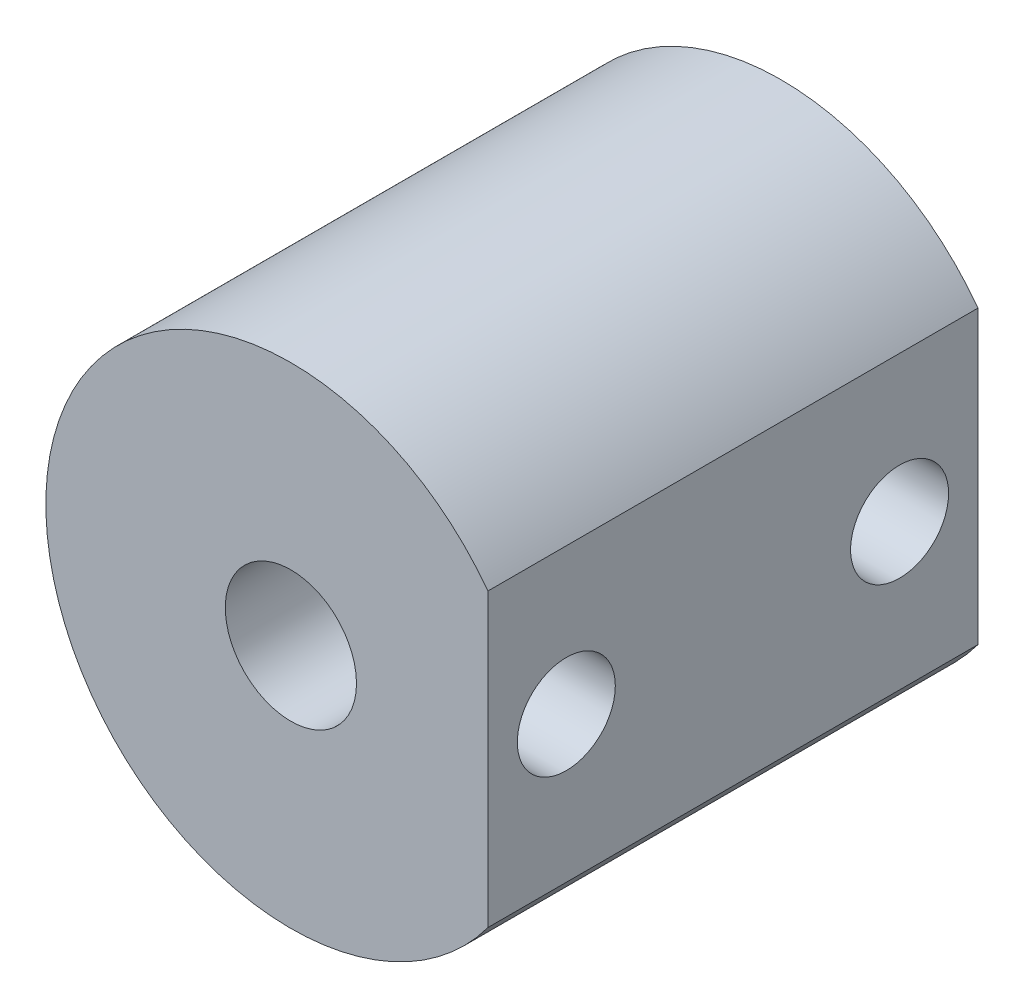
ISO-10303-21;
HEADER;
FILE_DESCRIPTION(('STEP AP214'),'2;1');
FILE_NAME('part.step','',(''),(''),'','','');
FILE_SCHEMA(('AUTOMOTIVE_DESIGN { 1 0 10303 214 1 1 1 1 }'));
ENDSEC;
DATA;
#1=APPLICATION_CONTEXT('core data for automotive mechanical design processes');
#2=APPLICATION_PROTOCOL_DEFINITION('international standard','automotive_design',2000,#1);
#3=PRODUCT_CONTEXT('',#1,'mechanical');
#4=PRODUCT('Part','Part','',(#3));
#5=PRODUCT_RELATED_PRODUCT_CATEGORY('part','',(#4));
#6=PRODUCT_DEFINITION_FORMATION('','',#4);
#7=PRODUCT_DEFINITION_CONTEXT('part definition',#1,'design');
#8=PRODUCT_DEFINITION('design','',#6,#7);
#9=PRODUCT_DEFINITION_SHAPE('','',#8);
#10=(LENGTH_UNIT() NAMED_UNIT(*) SI_UNIT(.MILLI.,.METRE.));
#11=(NAMED_UNIT(*) PLANE_ANGLE_UNIT() SI_UNIT($,.RADIAN.));
#12=(NAMED_UNIT(*) SI_UNIT($,.STERADIAN.) SOLID_ANGLE_UNIT());
#13=UNCERTAINTY_MEASURE_WITH_UNIT(LENGTH_MEASURE(1.E-05),#10,'distance_accuracy_value','');
#14=(GEOMETRIC_REPRESENTATION_CONTEXT(3) GLOBAL_UNCERTAINTY_ASSIGNED_CONTEXT((#13)) GLOBAL_UNIT_ASSIGNED_CONTEXT((#10,
#11,#12)) REPRESENTATION_CONTEXT('',''));
#15=CARTESIAN_POINT('',(0.,0.,0.));
#16=DIRECTION('',(0.,0.,1.));
#17=DIRECTION('',(1.,0.,0.));
#18=AXIS2_PLACEMENT_3D('',#15,#16,#17);
#19=CARTESIAN_POINT('',(0.,0.,6.35));
#20=DIRECTION('',(0.,0.,1.));
#21=DIRECTION('',(1.,0.,0.));
#22=AXIS2_PLACEMENT_3D('',#19,#20,#21);
#23=CYLINDRICAL_SURFACE('',#22,1.7);
#24=CARTESIAN_POINT('',(0.,0.,12.7));
#25=DIRECTION('',(0.,0.,1.));
#26=DIRECTION('',(1.,0.,0.));
#27=AXIS2_PLACEMENT_3D('',#24,#25,#26);
#28=CIRCLE('',#27,1.7);
#29=CARTESIAN_POINT('',(1.7,0.,12.7));
#30=VERTEX_POINT('',#29);
#31=EDGE_CURVE('E208',#30,#30,#28,.T.);
#32=ORIENTED_EDGE('',*,*,#31,.T.);
#33=EDGE_LOOP('',(#32));
#34=FACE_BOUND('',#33,.T.);
#35=CARTESIAN_POINT('',(0.,0.,6.35));
#36=DIRECTION('',(0.,0.,1.));
#37=DIRECTION('',(1.,0.,0.));
#38=AXIS2_PLACEMENT_3D('',#35,#36,#37);
#39=CIRCLE('',#38,1.7);
#40=CARTESIAN_POINT('',(1.7,0.,6.35));
#41=VERTEX_POINT('',#40);
#42=EDGE_CURVE('E211',#41,#41,#39,.T.);
#43=ORIENTED_EDGE('',*,*,#42,.F.);
#44=EDGE_LOOP('',(#43));
#45=FACE_BOUND('',#44,.T.);
#46=DIRECTION('',(0.,0.,1.));
#47=VECTOR('',#46,1.);
#48=CARTESIAN_POINT('',(1.2951946017097,1.10112258341297,6.35));
#49=LINE('',#48,#47);
#50=CARTESIAN_POINT('',(1.2951946017097,1.10112258341297,11.3007946399093));
#51=VERTEX_POINT('',#50);
#52=CARTESIAN_POINT('',(1.2951946017097,1.10112258341297,10.0352053600907));
#53=VERTEX_POINT('',#52);
#54=EDGE_CURVE('E11',#51,#53,#49,.F.);
#55=ORIENTED_EDGE('',*,*,#54,.F.);
#56=CARTESIAN_POINT('',(1.2951946017097,1.10112258341297,11.3007946399093));
#57=CARTESIAN_POINT('',(1.3113173687256,1.08216613180387,11.3337619197842));
#58=CARTESIAN_POINT('',(1.32787279571371,1.06184189359938,11.3657178927191));
#59=CARTESIAN_POINT('',(1.36137730272647,1.01852680407991,11.4275624808981));
#60=CARTESIAN_POINT('',(1.37832646814451,0.995535369906923,11.45745064198));
#61=CARTESIAN_POINT('',(1.41232141435796,0.946701619108911,11.5154108652147));
#62=CARTESIAN_POINT('',(1.42936626934783,0.920831262074049,11.5434598977748));
#63=CARTESIAN_POINT('',(1.46293509373535,0.866511129944811,11.5972581339285));
#64=CARTESIAN_POINT('',(1.47945908547812,0.838061465706677,11.6230074362681));
#65=CARTESIAN_POINT('',(1.52774249560604,0.748722638253251,11.696730436916));
#66=CARTESIAN_POINT('',(1.55813524484959,0.683951000967624,11.7410508948931));
#67=CARTESIAN_POINT('',(1.61184761600013,0.545361428989942,11.8176482286547));
#68=CARTESIAN_POINT('',(1.6352037706125,0.471593113324176,11.8499875170762));
#69=CARTESIAN_POINT('',(1.66668877775104,0.339598467941695,11.8931109365594));
#70=CARTESIAN_POINT('',(1.67727138425101,0.283103462620614,11.9074298176562));
#71=CARTESIAN_POINT('',(1.69268433558115,0.167893711182328,11.9282104668643));
#72=CARTESIAN_POINT('',(1.69751575531143,0.109179381975218,11.9346737032049));
#73=CARTESIAN_POINT('',(1.70100385596444,-0.00885758387635066,11.9393443321602));
#74=CARTESIAN_POINT('',(1.6996506015261,-0.0681810464494508,11.9375384408375));
#75=CARTESIAN_POINT('',(1.69086890222751,-0.185546160427944,11.9257570514304));
#76=CARTESIAN_POINT('',(1.68343948236335,-0.243587604580728,11.91578024221));
#77=CARTESIAN_POINT('',(1.66333003888365,-0.355691032554889,11.8885119373664));
#78=CARTESIAN_POINT('',(1.65075643217894,-0.409808915959445,11.8713685474691));
#79=CARTESIAN_POINT('',(1.62126304690074,-0.51425197559634,11.8305797762669));
#80=CARTESIAN_POINT('',(1.60434205153392,-0.564576084878069,11.8069325744754));
#81=CARTESIAN_POINT('',(1.56491177405399,-0.666630410538083,11.7507279904886));
#82=CARTESIAN_POINT('',(1.54197318693177,-0.717787690111496,11.7174368497656));
#83=CARTESIAN_POINT('',(1.49338732450105,-0.814069541165105,11.6446464234165));
#84=CARTESIAN_POINT('',(1.46773740934434,-0.859188134504203,11.6051410687988));
#85=CARTESIAN_POINT('',(1.41716784401171,-0.940071640037859,11.5237007181589));
#86=CARTESIAN_POINT('',(1.39233043272054,-0.976277877811575,11.4821505052677));
#87=CARTESIAN_POINT('',(1.34310354445216,-1.0429796213762,11.3946932034082));
#88=CARTESIAN_POINT('',(1.318712950277,-1.07349187716099,11.3487995117827));
#89=CARTESIAN_POINT('',(1.2951946017097,-1.10112258341297,11.3007946399093));
#90=B_SPLINE_CURVE_WITH_KNOTS('',3,(#56,#57,#58,#59,#60,#61,#62,#63,#64,#65,#66,#67,#68,#69,#70,
#71,#72,#73,#74,#75,#76,#77,#78,#79,#80,#81,#82,#83,#84,#85,#86,#87,#88,#89),.UNSPECIFIED.,.F.,
.F.,(4,2,2,2,2,2,2,2,2,2,2,2,2,2,2,2,4),(0.,0.123863180300836,0.247753479391506,
0.372978247877537,0.49819763686777,0.749183258251209,0.998842415639397,1.17578456463396,
1.35269363784413,1.52988700619039,1.70710881321811,1.88083625812305,2.05461238078352,
2.24951645474449,2.44461207353285,2.625539738844,2.80592647678083),.UNSPECIFIED.);
#91=CARTESIAN_POINT('',(1.2951946017097,-1.10112258341297,11.3007946399093));
#92=VERTEX_POINT('',#91);
#93=EDGE_CURVE('E126',#51,#92,#90,.T.);
#94=ORIENTED_EDGE('',*,*,#93,.T.);
#95=DIRECTION('',(0.,0.,1.));
#96=VECTOR('',#95,1.);
#97=CARTESIAN_POINT('',(1.2951946017097,-1.10112258341297,6.35));
#98=LINE('',#97,#96);
#99=CARTESIAN_POINT('',(1.2951946017097,-1.10112258341297,10.0352053600907));
#100=VERTEX_POINT('',#99);
#101=EDGE_CURVE('E48',#100,#92,#98,.T.);
#102=ORIENTED_EDGE('',*,*,#101,.F.);
#103=CARTESIAN_POINT('',(1.2951946017097,-1.10112258341297,10.0352053600907));
#104=CARTESIAN_POINT('',(1.3113173687256,-1.08216613180387,10.0022380802159));
#105=CARTESIAN_POINT('',(1.32787279571371,-1.06184189359938,9.97028210728091));
#106=CARTESIAN_POINT('',(1.36137730272647,-1.01852680407991,9.90843751910186));
#107=CARTESIAN_POINT('',(1.37832646814451,-0.995535369906923,9.87854935801997));
#108=CARTESIAN_POINT('',(1.41232141435796,-0.946701619108911,9.82058913478527));
#109=CARTESIAN_POINT('',(1.42936626934783,-0.920831262074049,9.79254010222524));
#110=CARTESIAN_POINT('',(1.46293509373535,-0.866511129944811,9.73874186607155));
#111=CARTESIAN_POINT('',(1.47945908547812,-0.838061465706677,9.71299256373194));
#112=CARTESIAN_POINT('',(1.52774249560604,-0.748722638253251,9.63926956308404));
#113=CARTESIAN_POINT('',(1.55813524484959,-0.683951000967624,9.59494910510688));
#114=CARTESIAN_POINT('',(1.61184761600013,-0.545361428989942,9.51835177134534));
#115=CARTESIAN_POINT('',(1.6352037706125,-0.471593113324176,9.48601248292378));
#116=CARTESIAN_POINT('',(1.66668877775104,-0.339598467941695,9.44288906344059));
#117=CARTESIAN_POINT('',(1.67727138425101,-0.283103462620614,9.42857018234377));
#118=CARTESIAN_POINT('',(1.69268433558115,-0.167893711182328,9.40778953313566));
#119=CARTESIAN_POINT('',(1.69751575531143,-0.109179381975218,9.40132629679508));
#120=CARTESIAN_POINT('',(1.70100385596444,0.00885758387635066,9.39665566783984));
#121=CARTESIAN_POINT('',(1.6996506015261,0.0681810464494508,9.39846155916254));
#122=CARTESIAN_POINT('',(1.69086890222751,0.185546160427944,9.4102429485696));
#123=CARTESIAN_POINT('',(1.68343948236335,0.243587604580728,9.42021975778995));
#124=CARTESIAN_POINT('',(1.66333003888365,0.355691032554889,9.44748806263355));
#125=CARTESIAN_POINT('',(1.65075643217894,0.409808915959445,9.46463145253094));
#126=CARTESIAN_POINT('',(1.62126304690074,0.51425197559634,9.50542022373306));
#127=CARTESIAN_POINT('',(1.60434205153392,0.564576084878069,9.52906742552461));
#128=CARTESIAN_POINT('',(1.56491177405399,0.666630410538083,9.58527200951145));
#129=CARTESIAN_POINT('',(1.54197318693177,0.717787690111496,9.61856315023443));
#130=CARTESIAN_POINT('',(1.49338732450105,0.814069541165105,9.69135357658346));
#131=CARTESIAN_POINT('',(1.46773740934434,0.859188134504203,9.73085893120118));
#132=CARTESIAN_POINT('',(1.41716784401171,0.940071640037859,9.8122992818411));
#133=CARTESIAN_POINT('',(1.39233043272054,0.976277877811575,9.8538494947323));
#134=CARTESIAN_POINT('',(1.34310354445216,1.0429796213762,9.94130679659184));
#135=CARTESIAN_POINT('',(1.318712950277,1.07349187716099,9.98720048821733));
#136=CARTESIAN_POINT('',(1.2951946017097,1.10112258341297,10.0352053600907));
#137=B_SPLINE_CURVE_WITH_KNOTS('',3,(#103,#104,#105,#106,#107,#108,#109,#110,#111,#112,#113,
#114,#115,#116,#117,#118,#119,#120,#121,#122,#123,#124,#125,#126,#127,#128,#129,#130,#131,#132,
#133,#134,#135,#136),.UNSPECIFIED.,.F.,.F.,(4,2,2,2,2,2,2,2,2,2,2,2,2,2,2,2,4),(0.,
0.123863180300834,0.247753479391506,0.372978247877537,0.49819763686777,0.749183258251209,
0.998842415639397,1.17578456463396,1.35269363784413,1.52988700619039,1.70710881321811,
1.88083625812305,2.05461238078352,2.24951645474449,2.44461207353285,2.625539738844,
2.80592647678083),.UNSPECIFIED.);
#138=EDGE_CURVE('E124',#100,#53,#137,.T.);
#139=ORIENTED_EDGE('',*,*,#138,.T.);
#140=EDGE_LOOP('',(#55,#94,#102,#139));
#141=FACE_BOUND('',#140,.T.);
#142=ADVANCED_FACE('F39',(#34,#45,#141),#23,.F.);
#143=CARTESIAN_POINT('',(0.,0.,12.7));
#144=DIRECTION('',(0.,0.,-1.));
#145=DIRECTION('',(-1.,0.,0.));
#146=AXIS2_PLACEMENT_3D('',#143,#144,#145);
#147=CYLINDRICAL_SURFACE('',#146,6.35);
#148=CARTESIAN_POINT('',(0.,0.,12.7));
#149=DIRECTION('',(0.,0.,1.));
#150=DIRECTION('',(1.,0.,0.));
#151=AXIS2_PLACEMENT_3D('',#148,#149,#150);
#152=CIRCLE('',#151,6.35);
#153=CARTESIAN_POINT('',(5.1051946017097,3.77617373523441,12.7));
#154=VERTEX_POINT('',#153);
#155=CARTESIAN_POINT('',(5.1051946017097,-3.77617373523441,12.7));
#156=VERTEX_POINT('',#155);
#157=EDGE_CURVE('E226',#154,#156,#152,.T.);
#158=ORIENTED_EDGE('',*,*,#157,.F.);
#159=DIRECTION('',(0.,0.,-1.));
#160=VECTOR('',#159,1.);
#161=CARTESIAN_POINT('',(5.1051946017097,3.77617373523441,12.7));
#162=LINE('',#161,#160);
#163=CARTESIAN_POINT('',(5.1051946017097,3.77617373523441,0.));
#164=VERTEX_POINT('',#163);
#165=EDGE_CURVE('E247',#154,#164,#162,.T.);
#166=ORIENTED_EDGE('',*,*,#165,.T.);
#167=CARTESIAN_POINT('',(0.,0.,0.));
#168=DIRECTION('',(0.,0.,1.));
#169=DIRECTION('',(1.,0.,0.));
#170=AXIS2_PLACEMENT_3D('',#167,#168,#169);
#171=CIRCLE('',#170,6.35);
#172=CARTESIAN_POINT('',(5.1051946017097,-3.77617373523441,0.));
#173=VERTEX_POINT('',#172);
#174=EDGE_CURVE('E218',#164,#173,#171,.T.);
#175=ORIENTED_EDGE('',*,*,#174,.T.);
#176=DIRECTION('',(0.,0.,-1.));
#177=VECTOR('',#176,1.);
#178=CARTESIAN_POINT('',(5.1051946017097,-3.77617373523441,14.224));
#179=LINE('',#178,#177);
#180=EDGE_CURVE('E62',#156,#173,#179,.T.);
#181=ORIENTED_EDGE('',*,*,#180,.F.);
#182=EDGE_LOOP('',(#158,#166,#175,#181));
#183=FACE_BOUND('',#182,.T.);
#184=ADVANCED_FACE('F41',(#183),#147,.T.);
#185=CARTESIAN_POINT('',(0.,0.,12.7));
#186=DIRECTION('',(0.,0.,1.));
#187=DIRECTION('',(1.,0.,0.));
#188=AXIS2_PLACEMENT_3D('',#185,#186,#187);
#189=PLANE('',#188);
#190=DIRECTION('',(0.,-1.,0.));
#191=VECTOR('',#190,1.);
#192=CARTESIAN_POINT('',(5.1051946017097,0.,12.7));
#193=LINE('',#192,#191);
#194=EDGE_CURVE('E245',#154,#156,#193,.T.);
#195=ORIENTED_EDGE('',*,*,#194,.F.);
#196=ORIENTED_EDGE('',*,*,#157,.T.);
#197=EDGE_LOOP('',(#195,#196));
#198=FACE_BOUND('',#197,.T.);
#199=ORIENTED_EDGE('',*,*,#31,.F.);
#200=EDGE_LOOP('',(#199));
#201=FACE_BOUND('',#200,.T.);
#202=ADVANCED_FACE('F203',(#198,#201),#189,.T.);
#203=CARTESIAN_POINT('',(0.,0.,0.));
#204=DIRECTION('',(0.,0.,1.));
#205=DIRECTION('',(1.,0.,0.));
#206=AXIS2_PLACEMENT_3D('',#203,#204,#205);
#207=PLANE('',#206);
#208=DIRECTION('',(-0.8672565875042,-0.497861437983069,0.));
#209=VECTOR('',#208,1.);
#210=CARTESIAN_POINT('',(2.54635924872807,-1.4785311766808,0.));
#211=LINE('',#210,#209);
#212=CARTESIAN_POINT('',(2.54635924872807,-1.4785311766808,0.));
#213=VERTEX_POINT('',#212);
#214=CARTESIAN_POINT('',(-0.00726593492883748,-2.94447738490035,0.));
#215=VERTEX_POINT('',#214);
#216=EDGE_CURVE('E268',#213,#215,#211,.T.);
#217=ORIENTED_EDGE('',*,*,#216,.F.);
#218=DIRECTION('',(-0.00246764089411244,-0.999996955369574,0.));
#219=VECTOR('',#218,1.);
#220=CARTESIAN_POINT('',(2.55362518365693,1.46594620821955,0.));
#221=LINE('',#220,#219);
#222=CARTESIAN_POINT('',(2.55362518365693,1.46594620821955,0.));
#223=VERTEX_POINT('',#222);
#224=EDGE_CURVE('E273',#223,#213,#221,.T.);
#225=ORIENTED_EDGE('',*,*,#224,.F.);
#226=DIRECTION('',(0.864788946610089,-0.502135517386504,0.));
#227=VECTOR('',#226,1.);
#228=CARTESIAN_POINT('',(0.00726593492886285,2.94447738490036,0.));
#229=LINE('',#228,#227);
#230=CARTESIAN_POINT('',(0.00726593492886285,2.94447738490036,0.));
#231=VERTEX_POINT('',#230);
#232=EDGE_CURVE('E279',#231,#223,#229,.T.);
#233=ORIENTED_EDGE('',*,*,#232,.F.);
#234=DIRECTION('',(0.867256587504202,0.497861437983067,0.));
#235=VECTOR('',#234,1.);
#236=CARTESIAN_POINT('',(-2.54635924872805,1.47853117668082,0.));
#237=LINE('',#236,#235);
#238=CARTESIAN_POINT('',(-2.54635924872805,1.47853117668082,0.));
#239=VERTEX_POINT('',#238);
#240=EDGE_CURVE('E311',#239,#231,#237,.T.);
#241=ORIENTED_EDGE('',*,*,#240,.F.);
#242=DIRECTION('',(0.00246764089410772,0.999996955369574,0.));
#243=VECTOR('',#242,1.);
#244=CARTESIAN_POINT('',(-2.55362518365689,-1.46594620821953,0.));
#245=LINE('',#244,#243);
#246=CARTESIAN_POINT('',(-2.55362518365689,-1.46594620821953,0.));
#247=VERTEX_POINT('',#246);
#248=EDGE_CURVE('E307',#247,#239,#245,.T.);
#249=ORIENTED_EDGE('',*,*,#248,.F.);
#250=DIRECTION('',(-0.864788946610088,0.502135517386506,0.));
#251=VECTOR('',#250,1.);
#252=CARTESIAN_POINT('',(-0.00726593492883748,-2.94447738490035,0.));
#253=LINE('',#252,#251);
#254=EDGE_CURVE('E303',#215,#247,#253,.T.);
#255=ORIENTED_EDGE('',*,*,#254,.F.);
#256=EDGE_LOOP('',(#217,#225,#233,#241,#249,#255));
#257=FACE_BOUND('',#256,.T.);
#258=ORIENTED_EDGE('',*,*,#174,.F.);
#259=DIRECTION('',(0.,1.,0.));
#260=VECTOR('',#259,1.);
#261=CARTESIAN_POINT('',(5.1051946017097,-3.77617373523441,0.));
#262=LINE('',#261,#260);
#263=EDGE_CURVE('E134',#173,#164,#262,.T.);
#264=ORIENTED_EDGE('',*,*,#263,.F.);
#265=EDGE_LOOP('',(#258,#264));
#266=FACE_BOUND('',#265,.T.);
#267=ADVANCED_FACE('F173',(#257,#266),#207,.F.);
#268=CARTESIAN_POINT('',(0.,0.,6.35));
#269=DIRECTION('',(0.,0.,-1.));
#270=DIRECTION('',(-1.,0.,0.));
#271=AXIS2_PLACEMENT_3D('',#268,#269,#270);
#272=PLANE('',#271);
#273=DIRECTION('',(-0.00246764089411244,-0.999996955369574,0.));
#274=VECTOR('',#273,1.);
#275=CARTESIAN_POINT('',(2.55362518365693,1.46594620821955,6.35));
#276=LINE('',#275,#274);
#277=CARTESIAN_POINT('',(2.55362518365693,1.46594620821955,6.35));
#278=VERTEX_POINT('',#277);
#279=CARTESIAN_POINT('',(2.54635924872807,-1.4785311766808,6.35));
#280=VERTEX_POINT('',#279);
#281=EDGE_CURVE('E274',#278,#280,#276,.T.);
#282=ORIENTED_EDGE('',*,*,#281,.T.);
#283=DIRECTION('',(-0.8672565875042,-0.497861437983069,0.));
#284=VECTOR('',#283,1.);
#285=CARTESIAN_POINT('',(2.54635924872807,-1.4785311766808,6.35));
#286=LINE('',#285,#284);
#287=CARTESIAN_POINT('',(-0.00726593492883748,-2.94447738490035,6.35));
#288=VERTEX_POINT('',#287);
#289=EDGE_CURVE('E278',#280,#288,#286,.T.);
#290=ORIENTED_EDGE('',*,*,#289,.T.);
#291=DIRECTION('',(-0.864788946610088,0.502135517386506,0.));
#292=VECTOR('',#291,1.);
#293=CARTESIAN_POINT('',(-0.00726593492883748,-2.94447738490035,6.35));
#294=LINE('',#293,#292);
#295=CARTESIAN_POINT('',(-2.55362518365689,-1.46594620821953,6.35));
#296=VERTEX_POINT('',#295);
#297=EDGE_CURVE('E283',#288,#296,#294,.T.);
#298=ORIENTED_EDGE('',*,*,#297,.T.);
#299=DIRECTION('',(0.00246764089410772,0.999996955369574,0.));
#300=VECTOR('',#299,1.);
#301=CARTESIAN_POINT('',(-2.55362518365689,-1.46594620821953,6.35));
#302=LINE('',#301,#300);
#303=CARTESIAN_POINT('',(-2.54635924872805,1.47853117668082,6.35));
#304=VERTEX_POINT('',#303);
#305=EDGE_CURVE('E287',#296,#304,#302,.T.);
#306=ORIENTED_EDGE('',*,*,#305,.T.);
#307=DIRECTION('',(0.867256587504202,0.497861437983067,0.));
#308=VECTOR('',#307,1.);
#309=CARTESIAN_POINT('',(-2.54635924872805,1.47853117668082,6.35));
#310=LINE('',#309,#308);
#311=CARTESIAN_POINT('',(0.00726593492886285,2.94447738490036,6.35));
#312=VERTEX_POINT('',#311);
#313=EDGE_CURVE('E291',#304,#312,#310,.T.);
#314=ORIENTED_EDGE('',*,*,#313,.T.);
#315=DIRECTION('',(0.864788946610089,-0.502135517386504,0.));
#316=VECTOR('',#315,1.);
#317=CARTESIAN_POINT('',(0.00726593492886285,2.94447738490036,6.35));
#318=LINE('',#317,#316);
#319=EDGE_CURVE('E295',#312,#278,#318,.T.);
#320=ORIENTED_EDGE('',*,*,#319,.T.);
#321=EDGE_LOOP('',(#282,#290,#298,#306,#314,#320));
#322=FACE_BOUND('',#321,.T.);
#323=ORIENTED_EDGE('',*,*,#42,.T.);
#324=EDGE_LOOP('',(#323));
#325=FACE_BOUND('',#324,.T.);
#326=ADVANCED_FACE('F169',(#322,#325),#272,.T.);
#327=CARTESIAN_POINT('',(2.55362518365693,1.46594620821955,6.35));
#328=DIRECTION('',(0.999996955369574,-0.00246764089411244,0.));
#329=DIRECTION('',(0.00246764089411244,0.999996955369574,0.));
#330=AXIS2_PLACEMENT_3D('',#327,#328,#329);
#331=PLANE('',#330);
#332=CARTESIAN_POINT('',(2.55000774383119,0.,2.032));
#333=DIRECTION('',(0.999996955369574,-0.00246764089411244,0.));
#334=DIRECTION('',(0.00246764089411244,0.999996955369574,0.));
#335=AXIS2_PLACEMENT_3D('',#332,#333,#334);
#336=ELLIPSE('',#335,1.27000386669241,1.27);
#337=CARTESIAN_POINT('',(2.55314165730832,1.27,2.032));
#338=VERTEX_POINT('',#337);
#339=EDGE_CURVE('E128',#338,#338,#336,.T.);
#340=ORIENTED_EDGE('',*,*,#339,.T.);
#341=EDGE_LOOP('',(#340));
#342=FACE_BOUND('',#341,.T.);
#343=ORIENTED_EDGE('',*,*,#224,.T.);
#344=DIRECTION('',(0.,0.,-1.));
#345=VECTOR('',#344,1.);
#346=CARTESIAN_POINT('',(2.54635924872807,-1.4785311766808,6.35));
#347=LINE('',#346,#345);
#348=EDGE_CURVE('E223',#280,#213,#347,.T.);
#349=ORIENTED_EDGE('',*,*,#348,.F.);
#350=ORIENTED_EDGE('',*,*,#281,.F.);
#351=DIRECTION('',(0.,0.,-1.));
#352=VECTOR('',#351,1.);
#353=CARTESIAN_POINT('',(2.55362518365693,1.46594620821955,6.35));
#354=LINE('',#353,#352);
#355=EDGE_CURVE('E214',#278,#223,#354,.T.);
#356=ORIENTED_EDGE('',*,*,#355,.T.);
#357=EDGE_LOOP('',(#343,#349,#350,#356));
#358=FACE_BOUND('',#357,.T.);
#359=ADVANCED_FACE('F172',(#342,#358),#331,.F.);
#360=CARTESIAN_POINT('',(0.00726593492886285,2.94447738490036,6.35));
#361=DIRECTION('',(0.502135517386504,0.864788946610089,0.));
#362=DIRECTION('',(-0.864788946610089,0.502135517386504,0.));
#363=AXIS2_PLACEMENT_3D('',#360,#361,#362);
#364=PLANE('',#363);
#365=ORIENTED_EDGE('',*,*,#232,.T.);
#366=ORIENTED_EDGE('',*,*,#355,.F.);
#367=ORIENTED_EDGE('',*,*,#319,.F.);
#368=DIRECTION('',(0.,0.,-1.));
#369=VECTOR('',#368,1.);
#370=CARTESIAN_POINT('',(0.00726593492886285,2.94447738490036,6.35));
#371=LINE('',#370,#369);
#372=EDGE_CURVE('E220',#312,#231,#371,.T.);
#373=ORIENTED_EDGE('',*,*,#372,.T.);
#374=EDGE_LOOP('',(#365,#366,#367,#373));
#375=FACE_BOUND('',#374,.T.);
#376=ADVANCED_FACE('F175',(#375),#364,.F.);
#377=CARTESIAN_POINT('',(-2.54635924872805,1.47853117668082,6.35));
#378=DIRECTION('',(-0.497861437983067,0.867256587504202,0.));
#379=DIRECTION('',(-0.867256587504202,-0.497861437983067,0.));
#380=AXIS2_PLACEMENT_3D('',#377,#378,#379);
#381=PLANE('',#380);
#382=ORIENTED_EDGE('',*,*,#240,.T.);
#383=ORIENTED_EDGE('',*,*,#372,.F.);
#384=ORIENTED_EDGE('',*,*,#313,.F.);
#385=DIRECTION('',(0.,0.,-1.));
#386=VECTOR('',#385,1.);
#387=CARTESIAN_POINT('',(-2.54635924872805,1.47853117668082,6.35));
#388=LINE('',#387,#386);
#389=EDGE_CURVE('E320',#304,#239,#388,.T.);
#390=ORIENTED_EDGE('',*,*,#389,.T.);
#391=EDGE_LOOP('',(#382,#383,#384,#390));
#392=FACE_BOUND('',#391,.T.);
#393=ADVANCED_FACE('F178',(#392),#381,.F.);
#394=CARTESIAN_POINT('',(-2.55362518365689,-1.46594620821953,6.35));
#395=DIRECTION('',(-0.999996955369574,0.00246764089410772,0.));
#396=DIRECTION('',(-0.00246764089410772,-0.999996955369574,0.));
#397=AXIS2_PLACEMENT_3D('',#394,#395,#396);
#398=PLANE('',#397);
#399=ORIENTED_EDGE('',*,*,#248,.T.);
#400=ORIENTED_EDGE('',*,*,#389,.F.);
#401=ORIENTED_EDGE('',*,*,#305,.F.);
#402=DIRECTION('',(0.,0.,-1.));
#403=VECTOR('',#402,1.);
#404=CARTESIAN_POINT('',(-2.55362518365689,-1.46594620821953,6.35));
#405=LINE('',#404,#403);
#406=EDGE_CURVE('E323',#296,#247,#405,.T.);
#407=ORIENTED_EDGE('',*,*,#406,.T.);
#408=EDGE_LOOP('',(#399,#400,#401,#407));
#409=FACE_BOUND('',#408,.T.);
#410=ADVANCED_FACE('F182',(#409),#398,.F.);
#411=CARTESIAN_POINT('',(-0.00726593492883748,-2.94447738490035,6.35));
#412=DIRECTION('',(-0.502135517386506,-0.864788946610088,0.));
#413=DIRECTION('',(0.864788946610088,-0.502135517386506,0.));
#414=AXIS2_PLACEMENT_3D('',#411,#412,#413);
#415=PLANE('',#414);
#416=ORIENTED_EDGE('',*,*,#254,.T.);
#417=ORIENTED_EDGE('',*,*,#406,.F.);
#418=ORIENTED_EDGE('',*,*,#297,.F.);
#419=DIRECTION('',(0.,0.,-1.));
#420=VECTOR('',#419,1.);
#421=CARTESIAN_POINT('',(-0.00726593492883748,-2.94447738490035,6.35));
#422=LINE('',#421,#420);
#423=EDGE_CURVE('E325',#288,#215,#422,.T.);
#424=ORIENTED_EDGE('',*,*,#423,.T.);
#425=EDGE_LOOP('',(#416,#417,#418,#424));
#426=FACE_BOUND('',#425,.T.);
#427=ADVANCED_FACE('F186',(#426),#415,.F.);
#428=CARTESIAN_POINT('',(2.54635924872807,-1.4785311766808,6.35));
#429=DIRECTION('',(0.497861437983069,-0.8672565875042,0.));
#430=DIRECTION('',(0.8672565875042,0.497861437983069,0.));
#431=AXIS2_PLACEMENT_3D('',#428,#429,#430);
#432=PLANE('',#431);
#433=ORIENTED_EDGE('',*,*,#216,.T.);
#434=ORIENTED_EDGE('',*,*,#423,.F.);
#435=ORIENTED_EDGE('',*,*,#289,.F.);
#436=ORIENTED_EDGE('',*,*,#348,.T.);
#437=EDGE_LOOP('',(#433,#434,#435,#436));
#438=FACE_BOUND('',#437,.T.);
#439=ADVANCED_FACE('F167',(#438),#432,.F.);
#440=CARTESIAN_POINT('',(5.1051946017097,-3.77617373523441,14.224));
#441=DIRECTION('',(-1.,0.,0.));
#442=DIRECTION('',(0.,0.,1.));
#443=AXIS2_PLACEMENT_3D('',#440,#441,#442);
#444=PLANE('',#443);
#445=CARTESIAN_POINT('',(5.1051946017097,0.,10.668));
#446=DIRECTION('',(1.,0.,0.));
#447=DIRECTION('',(0.,0.,-1.));
#448=AXIS2_PLACEMENT_3D('',#445,#446,#447);
#449=CIRCLE('',#448,1.27);
#450=CARTESIAN_POINT('',(5.1051946017097,0.,9.398));
#451=VERTEX_POINT('',#450);
#452=EDGE_CURVE('E234',#451,#451,#449,.T.);
#453=ORIENTED_EDGE('',*,*,#452,.F.);
#454=EDGE_LOOP('',(#453));
#455=FACE_BOUND('',#454,.T.);
#456=CARTESIAN_POINT('',(5.1051946017097,0.,2.032));
#457=DIRECTION('',(1.,0.,0.));
#458=DIRECTION('',(0.,0.,-1.));
#459=AXIS2_PLACEMENT_3D('',#456,#457,#458);
#460=CIRCLE('',#459,1.27);
#461=CARTESIAN_POINT('',(5.1051946017097,0.,0.762));
#462=VERTEX_POINT('',#461);
#463=EDGE_CURVE('E237',#462,#462,#460,.T.);
#464=ORIENTED_EDGE('',*,*,#463,.F.);
#465=EDGE_LOOP('',(#464));
#466=FACE_BOUND('',#465,.T.);
#467=ORIENTED_EDGE('',*,*,#194,.T.);
#468=ORIENTED_EDGE('',*,*,#180,.T.);
#469=ORIENTED_EDGE('',*,*,#263,.T.);
#470=ORIENTED_EDGE('',*,*,#165,.F.);
#471=EDGE_LOOP('',(#467,#468,#469,#470));
#472=FACE_BOUND('',#471,.T.);
#473=ADVANCED_FACE('F163',(#455,#466,#472),#444,.F.);
#474=CARTESIAN_POINT('',(1.2951946017097,0.,2.032));
#475=DIRECTION('',(1.,0.,0.));
#476=DIRECTION('',(0.,0.,-1.));
#477=AXIS2_PLACEMENT_3D('',#474,#475,#476);
#478=CYLINDRICAL_SURFACE('',#477,1.27);
#479=ORIENTED_EDGE('',*,*,#463,.T.);
#480=EDGE_LOOP('',(#479));
#481=FACE_BOUND('',#480,.T.);
#482=ORIENTED_EDGE('',*,*,#339,.F.);
#483=EDGE_LOOP('',(#482));
#484=FACE_BOUND('',#483,.T.);
#485=ADVANCED_FACE('F159',(#481,#484),#478,.F.);
#486=CARTESIAN_POINT('',(1.2951946017097,0.,10.668));
#487=DIRECTION('',(1.,0.,0.));
#488=DIRECTION('',(0.,0.,-1.));
#489=AXIS2_PLACEMENT_3D('',#486,#487,#488);
#490=PLANE('',#489);
#491=ORIENTED_EDGE('',*,*,#54,.T.);
#492=CARTESIAN_POINT('',(1.2951946017097,0.,10.668));
#493=DIRECTION('',(1.,0.,0.));
#494=DIRECTION('',(0.,0.,-1.));
#495=AXIS2_PLACEMENT_3D('',#492,#493,#494);
#496=CIRCLE('',#495,1.27);
#497=EDGE_CURVE('E118',#53,#51,#496,.T.);
#498=ORIENTED_EDGE('',*,*,#497,.T.);
#499=EDGE_LOOP('',(#491,#498));
#500=FACE_BOUND('',#499,.T.);
#501=ADVANCED_FACE('F117',(#500),#490,.T.);
#502=ORIENTED_EDGE('',*,*,#101,.T.);
#503=EDGE_CURVE('E54',#92,#100,#496,.T.);
#504=ORIENTED_EDGE('',*,*,#503,.T.);
#505=EDGE_LOOP('',(#502,#504));
#506=FACE_BOUND('',#505,.T.);
#507=ADVANCED_FACE('F157',(#506),#490,.T.);
#508=CARTESIAN_POINT('',(1.2951946017097,0.,10.668));
#509=DIRECTION('',(1.,0.,0.));
#510=DIRECTION('',(0.,0.,-1.));
#511=AXIS2_PLACEMENT_3D('',#508,#509,#510);
#512=CYLINDRICAL_SURFACE('',#511,1.27);
#513=ORIENTED_EDGE('',*,*,#452,.T.);
#514=EDGE_LOOP('',(#513));
#515=FACE_BOUND('',#514,.T.);
#516=ORIENTED_EDGE('',*,*,#497,.F.);
#517=ORIENTED_EDGE('',*,*,#138,.F.);
#518=ORIENTED_EDGE('',*,*,#503,.F.);
#519=ORIENTED_EDGE('',*,*,#93,.F.);
#520=EDGE_LOOP('',(#516,#517,#518,#519));
#521=FACE_BOUND('',#520,.T.);
#522=ADVANCED_FACE('F123',(#515,#521),#512,.F.);
#523=CLOSED_SHELL('',(#142,#184,#202,#267,#326,#359,#376,#393,#410,#427,#439,#473,#485,#501,
#507,#522));
#524=MANIFOLD_SOLID_BREP('B2',#523);
#525=ADVANCED_BREP_SHAPE_REPRESENTATION('',(#18,#524),#14);
#526=SHAPE_DEFINITION_REPRESENTATION(#9,#525);
ENDSEC;
END-ISO-10303-21;
